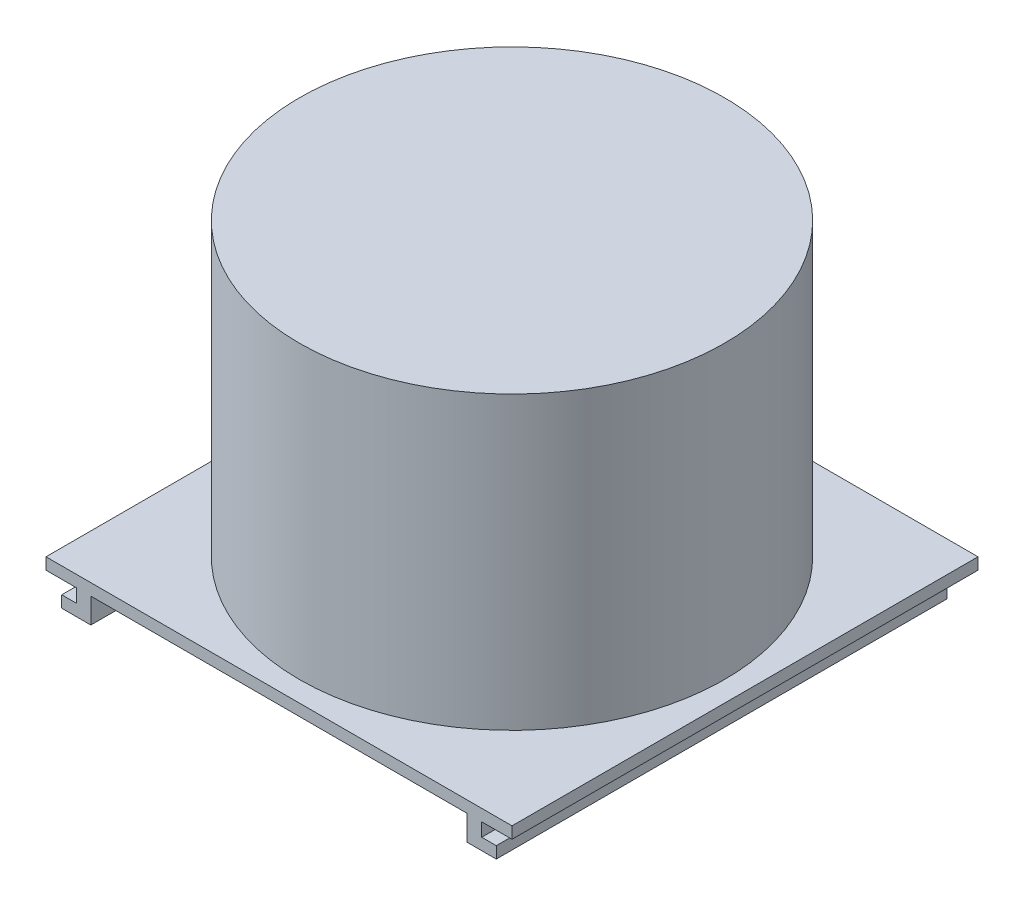
ISO-10303-21;
HEADER;
FILE_DESCRIPTION(('STEP AP214'),'2;1');
FILE_NAME('part.step','',(''),(''),'','','');
FILE_SCHEMA(('AUTOMOTIVE_DESIGN { 1 0 10303 214 1 1 1 1 }'));
ENDSEC;
DATA;
#1=APPLICATION_CONTEXT('core data for automotive mechanical design processes');
#2=APPLICATION_PROTOCOL_DEFINITION('international standard','automotive_design',2000,#1);
#3=PRODUCT_CONTEXT('',#1,'mechanical');
#4=PRODUCT('Part','Part','',(#3));
#5=PRODUCT_RELATED_PRODUCT_CATEGORY('part','',(#4));
#6=PRODUCT_DEFINITION_FORMATION('','',#4);
#7=PRODUCT_DEFINITION_CONTEXT('part definition',#1,'design');
#8=PRODUCT_DEFINITION('design','',#6,#7);
#9=PRODUCT_DEFINITION_SHAPE('','',#8);
#10=(LENGTH_UNIT() NAMED_UNIT(*) SI_UNIT(.MILLI.,.METRE.));
#11=(NAMED_UNIT(*) PLANE_ANGLE_UNIT() SI_UNIT($,.RADIAN.));
#12=(NAMED_UNIT(*) SI_UNIT($,.STERADIAN.) SOLID_ANGLE_UNIT());
#13=UNCERTAINTY_MEASURE_WITH_UNIT(LENGTH_MEASURE(1.E-05),#10,'distance_accuracy_value','');
#14=(GEOMETRIC_REPRESENTATION_CONTEXT(3) GLOBAL_UNCERTAINTY_ASSIGNED_CONTEXT((#13)) GLOBAL_UNIT_ASSIGNED_CONTEXT((#10,
#11,#12)) REPRESENTATION_CONTEXT('',''));
#15=CARTESIAN_POINT('',(0.,0.,0.));
#16=DIRECTION('',(0.,0.,1.));
#17=DIRECTION('',(1.,0.,0.));
#18=AXIS2_PLACEMENT_3D('',#15,#16,#17);
#19=CARTESIAN_POINT('',(0.,-2.,0.));
#20=DIRECTION('',(0.,1.,0.));
#21=DIRECTION('',(0.,0.,1.));
#22=AXIS2_PLACEMENT_3D('',#19,#20,#21);
#23=CYLINDRICAL_SURFACE('',#22,35.);
#24=CARTESIAN_POINT('',(0.,-2.,0.));
#25=DIRECTION('',(0.,1.,0.));
#26=DIRECTION('',(0.,0.,1.));
#27=AXIS2_PLACEMENT_3D('',#24,#25,#26);
#28=CIRCLE('',#27,35.);
#29=CARTESIAN_POINT('',(-32.3,-2.,-13.4799851631966));
#30=VERTEX_POINT('',#29);
#31=CARTESIAN_POINT('',(-34.8,-2.,-3.73630833845392));
#32=VERTEX_POINT('',#31);
#33=EDGE_CURVE('E297',#30,#32,#28,.T.);
#34=ORIENTED_EDGE('',*,*,#33,.F.);
#35=CARTESIAN_POINT('',(32.3,-1.99999999999999,-13.4799851631966));
#36=VERTEX_POINT('',#35);
#37=EDGE_CURVE('E296',#36,#30,#28,.T.);
#38=ORIENTED_EDGE('',*,*,#37,.F.);
#39=CARTESIAN_POINT('',(34.8,-2.,-3.73630833845404));
#40=VERTEX_POINT('',#39);
#41=EDGE_CURVE('E383',#40,#36,#28,.T.);
#42=ORIENTED_EDGE('',*,*,#41,.F.);
#43=CARTESIAN_POINT('',(34.8,-1.99999999999999,3.73630833845405));
#44=VERTEX_POINT('',#43);
#45=EDGE_CURVE('E394',#44,#40,#28,.T.);
#46=ORIENTED_EDGE('',*,*,#45,.F.);
#47=CARTESIAN_POINT('',(32.3,-2.,13.4799851631966));
#48=VERTEX_POINT('',#47);
#49=EDGE_CURVE('E408',#48,#44,#28,.T.);
#50=ORIENTED_EDGE('',*,*,#49,.F.);
#51=CARTESIAN_POINT('',(-32.3,-2.,13.4799851631966));
#52=VERTEX_POINT('',#51);
#53=EDGE_CURVE('E378',#52,#48,#28,.T.);
#54=ORIENTED_EDGE('',*,*,#53,.F.);
#55=CARTESIAN_POINT('',(-34.8,-2.,3.73630833845394));
#56=VERTEX_POINT('',#55);
#57=EDGE_CURVE('E373',#56,#52,#28,.T.);
#58=ORIENTED_EDGE('',*,*,#57,.F.);
#59=EDGE_CURVE('E301',#32,#56,#28,.T.);
#60=ORIENTED_EDGE('',*,*,#59,.F.);
#61=EDGE_LOOP('',(#34,#38,#42,#46,#50,#54,#58,#60));
#62=FACE_BOUND('',#61,.T.);
#63=CARTESIAN_POINT('',(0.,48.5,0.));
#64=DIRECTION('',(0.,1.,0.));
#65=DIRECTION('',(0.,0.,1.));
#66=AXIS2_PLACEMENT_3D('',#63,#64,#65);
#67=CIRCLE('',#66,35.);
#68=CARTESIAN_POINT('',(0.,48.5,35.));
#69=VERTEX_POINT('',#68);
#70=EDGE_CURVE('E12',#69,#69,#67,.F.);
#71=ORIENTED_EDGE('',*,*,#70,.F.);
#72=EDGE_LOOP('',(#71));
#73=FACE_BOUND('',#72,.T.);
#74=ADVANCED_FACE('F38',(#62,#73),#23,.F.);
#75=CARTESIAN_POINT('',(0.,-2.,0.));
#76=DIRECTION('',(0.,1.,0.));
#77=DIRECTION('',(0.,0.,1.));
#78=AXIS2_PLACEMENT_3D('',#75,#76,#77);
#79=PLANE('',#78);
#80=ORIENTED_EDGE('',*,*,#53,.T.);
#81=DIRECTION('',(0.,0.,1.));
#82=VECTOR('',#81,1.);
#83=CARTESIAN_POINT('',(32.3,-1.99999999999999,-46.594694837519));
#84=LINE('',#83,#82);
#85=CARTESIAN_POINT('',(32.3,-2.,40.));
#86=VERTEX_POINT('',#85);
#87=EDGE_CURVE('E192',#48,#86,#84,.T.);
#88=ORIENTED_EDGE('',*,*,#87,.T.);
#89=DIRECTION('',(1.,0.,0.));
#90=VECTOR('',#89,1.);
#91=CARTESIAN_POINT('',(0.,-2.,40.));
#92=LINE('',#91,#90);
#93=CARTESIAN_POINT('',(-32.3,-2.,40.));
#94=VERTEX_POINT('',#93);
#95=EDGE_CURVE('E288',#94,#86,#92,.T.);
#96=ORIENTED_EDGE('',*,*,#95,.F.);
#97=DIRECTION('',(0.,0.,1.));
#98=VECTOR('',#97,1.);
#99=CARTESIAN_POINT('',(-32.3,-2.,-46.594694837519));
#100=LINE('',#99,#98);
#101=EDGE_CURVE('E46',#52,#94,#100,.T.);
#102=ORIENTED_EDGE('',*,*,#101,.F.);
#103=EDGE_LOOP('',(#80,#88,#96,#102));
#104=FACE_BOUND('',#103,.T.);
#105=ADVANCED_FACE('F398',(#104),#79,.F.);
#106=CARTESIAN_POINT('',(34.8,-2.,40.));
#107=VERTEX_POINT('',#106);
#108=CARTESIAN_POINT('',(40.,-2.,40.));
#109=VERTEX_POINT('',#108);
#110=EDGE_CURVE('E289',#107,#109,#92,.T.);
#111=ORIENTED_EDGE('',*,*,#110,.F.);
#112=DIRECTION('',(0.,0.,1.));
#113=VECTOR('',#112,1.);
#114=CARTESIAN_POINT('',(34.8,-1.99999999999999,-46.594694837519));
#115=LINE('',#114,#113);
#116=EDGE_CURVE('E207',#44,#107,#115,.T.);
#117=ORIENTED_EDGE('',*,*,#116,.F.);
#118=ORIENTED_EDGE('',*,*,#45,.T.);
#119=CARTESIAN_POINT('',(34.8,-2.,-37.35));
#120=VERTEX_POINT('',#119);
#121=EDGE_CURVE('E53',#120,#40,#115,.T.);
#122=ORIENTED_EDGE('',*,*,#121,.F.);
#123=DIRECTION('',(1.,0.,0.));
#124=VECTOR('',#123,1.);
#125=CARTESIAN_POINT('',(34.8,-1.99999999999999,-37.35));
#126=LINE('',#125,#124);
#127=CARTESIAN_POINT('',(32.3,-2.,-37.35));
#128=VERTEX_POINT('',#127);
#129=EDGE_CURVE('E57',#128,#120,#126,.T.);
#130=ORIENTED_EDGE('',*,*,#129,.F.);
#131=EDGE_CURVE('E208',#128,#36,#84,.T.);
#132=ORIENTED_EDGE('',*,*,#131,.T.);
#133=ORIENTED_EDGE('',*,*,#37,.T.);
#134=CARTESIAN_POINT('',(-32.3,-2.,-37.35));
#135=VERTEX_POINT('',#134);
#136=EDGE_CURVE('E265',#135,#30,#100,.T.);
#137=ORIENTED_EDGE('',*,*,#136,.F.);
#138=DIRECTION('',(-1.,0.,0.));
#139=VECTOR('',#138,1.);
#140=CARTESIAN_POINT('',(0.,-2.,-37.35));
#141=LINE('',#140,#139);
#142=CARTESIAN_POINT('',(-34.8,-2.,-37.35));
#143=VERTEX_POINT('',#142);
#144=EDGE_CURVE('E239',#135,#143,#141,.T.);
#145=ORIENTED_EDGE('',*,*,#144,.T.);
#146=DIRECTION('',(0.,0.,1.));
#147=VECTOR('',#146,1.);
#148=CARTESIAN_POINT('',(-34.8,-2.,-46.594694837519));
#149=LINE('',#148,#147);
#150=EDGE_CURVE('E260',#143,#32,#149,.T.);
#151=ORIENTED_EDGE('',*,*,#150,.T.);
#152=ORIENTED_EDGE('',*,*,#59,.T.);
#153=CARTESIAN_POINT('',(-34.8,-2.,40.));
#154=VERTEX_POINT('',#153);
#155=EDGE_CURVE('E264',#56,#154,#149,.T.);
#156=ORIENTED_EDGE('',*,*,#155,.T.);
#157=CARTESIAN_POINT('',(-40.,-2.,40.));
#158=VERTEX_POINT('',#157);
#159=EDGE_CURVE('E284',#158,#154,#92,.T.);
#160=ORIENTED_EDGE('',*,*,#159,.F.);
#161=DIRECTION('',(0.,0.,-1.));
#162=VECTOR('',#161,1.);
#163=CARTESIAN_POINT('',(-40.,-2.,0.));
#164=LINE('',#163,#162);
#165=CARTESIAN_POINT('',(-40.,-2.,-40.));
#166=VERTEX_POINT('',#165);
#167=EDGE_CURVE('E294',#158,#166,#164,.T.);
#168=ORIENTED_EDGE('',*,*,#167,.T.);
#169=DIRECTION('',(1.,0.,0.));
#170=VECTOR('',#169,1.);
#171=CARTESIAN_POINT('',(0.,-2.,-40.));
#172=LINE('',#171,#170);
#173=CARTESIAN_POINT('',(40.,-2.,-40.));
#174=VERTEX_POINT('',#173);
#175=EDGE_CURVE('E292',#166,#174,#172,.T.);
#176=ORIENTED_EDGE('',*,*,#175,.T.);
#177=DIRECTION('',(0.,0.,-1.));
#178=VECTOR('',#177,1.);
#179=CARTESIAN_POINT('',(40.,-2.,0.));
#180=LINE('',#179,#178);
#181=EDGE_CURVE('E287',#109,#174,#180,.T.);
#182=ORIENTED_EDGE('',*,*,#181,.F.);
#183=EDGE_LOOP('',(#111,#117,#118,#122,#130,#132,#133,#137,#145,#151,#152,#156,#160,#168,#176,#182));
#184=FACE_BOUND('',#183,.T.);
#185=ADVANCED_FACE('F337',(#184),#79,.F.);
#186=CARTESIAN_POINT('',(0.,-2.,40.));
#187=DIRECTION('',(0.,0.,1.));
#188=DIRECTION('',(1.,0.,0.));
#189=AXIS2_PLACEMENT_3D('',#186,#187,#188);
#190=PLANE('',#189);
#191=DIRECTION('',(1.,0.,0.));
#192=VECTOR('',#191,1.);
#193=CARTESIAN_POINT('',(0.,0.,40.));
#194=LINE('',#193,#192);
#195=CARTESIAN_POINT('',(-40.,0.,40.));
#196=VERTEX_POINT('',#195);
#197=CARTESIAN_POINT('',(40.,0.,40.));
#198=VERTEX_POINT('',#197);
#199=EDGE_CURVE('E281',#196,#198,#194,.T.);
#200=ORIENTED_EDGE('',*,*,#199,.F.);
#201=DIRECTION('',(0.,1.,0.));
#202=VECTOR('',#201,1.);
#203=CARTESIAN_POINT('',(-40.,-2.,40.));
#204=LINE('',#203,#202);
#205=EDGE_CURVE('E312',#158,#196,#204,.T.);
#206=ORIENTED_EDGE('',*,*,#205,.F.);
#207=ORIENTED_EDGE('',*,*,#159,.T.);
#208=DIRECTION('',(0.,1.,0.));
#209=VECTOR('',#208,1.);
#210=CARTESIAN_POINT('',(-34.8,0.,40.));
#211=LINE('',#210,#209);
#212=CARTESIAN_POINT('',(-34.8,-4.3,40.));
#213=VERTEX_POINT('',#212);
#214=EDGE_CURVE('E223',#213,#154,#211,.T.);
#215=ORIENTED_EDGE('',*,*,#214,.F.);
#216=DIRECTION('',(1.,0.,0.));
#217=VECTOR('',#216,1.);
#218=CARTESIAN_POINT('',(0.,-4.3,40.));
#219=LINE('',#218,#217);
#220=CARTESIAN_POINT('',(-37.3,-4.3,40.));
#221=VERTEX_POINT('',#220);
#222=EDGE_CURVE('E247',#221,#213,#219,.T.);
#223=ORIENTED_EDGE('',*,*,#222,.F.);
#224=DIRECTION('',(0.,1.,0.));
#225=VECTOR('',#224,1.);
#226=CARTESIAN_POINT('',(-37.3,0.,40.));
#227=LINE('',#226,#225);
#228=CARTESIAN_POINT('',(-37.3,-6.3,40.));
#229=VERTEX_POINT('',#228);
#230=EDGE_CURVE('E250',#229,#221,#227,.T.);
#231=ORIENTED_EDGE('',*,*,#230,.F.);
#232=DIRECTION('',(-1.,0.,0.));
#233=VECTOR('',#232,1.);
#234=CARTESIAN_POINT('',(0.,-6.29999999999999,40.));
#235=LINE('',#234,#233);
#236=CARTESIAN_POINT('',(-32.3,-6.3,40.));
#237=VERTEX_POINT('',#236);
#238=EDGE_CURVE('E253',#237,#229,#235,.T.);
#239=ORIENTED_EDGE('',*,*,#238,.F.);
#240=DIRECTION('',(0.,-1.,0.));
#241=VECTOR('',#240,1.);
#242=CARTESIAN_POINT('',(-32.3,0.,40.));
#243=LINE('',#242,#241);
#244=EDGE_CURVE('E256',#94,#237,#243,.T.);
#245=ORIENTED_EDGE('',*,*,#244,.F.);
#246=ORIENTED_EDGE('',*,*,#95,.T.);
#247=DIRECTION('',(0.,-1.,0.));
#248=VECTOR('',#247,1.);
#249=CARTESIAN_POINT('',(32.3,-1.99999999999999,40.));
#250=LINE('',#249,#248);
#251=CARTESIAN_POINT('',(32.3,-6.29999999999999,40.));
#252=VERTEX_POINT('',#251);
#253=EDGE_CURVE('E220',#86,#252,#250,.T.);
#254=ORIENTED_EDGE('',*,*,#253,.T.);
#255=DIRECTION('',(1.,0.,0.));
#256=VECTOR('',#255,1.);
#257=CARTESIAN_POINT('',(32.3,-6.29999999999999,40.));
#258=LINE('',#257,#256);
#259=CARTESIAN_POINT('',(37.3,-6.3,40.));
#260=VERTEX_POINT('',#259);
#261=EDGE_CURVE('E217',#252,#260,#258,.T.);
#262=ORIENTED_EDGE('',*,*,#261,.T.);
#263=DIRECTION('',(0.,1.,0.));
#264=VECTOR('',#263,1.);
#265=CARTESIAN_POINT('',(37.3,-6.3,40.));
#266=LINE('',#265,#264);
#267=CARTESIAN_POINT('',(37.3,-4.3,40.));
#268=VERTEX_POINT('',#267);
#269=EDGE_CURVE('E215',#260,#268,#266,.T.);
#270=ORIENTED_EDGE('',*,*,#269,.T.);
#271=DIRECTION('',(-1.,0.,0.));
#272=VECTOR('',#271,1.);
#273=CARTESIAN_POINT('',(37.3,-4.3,40.));
#274=LINE('',#273,#272);
#275=CARTESIAN_POINT('',(34.8,-4.29999999999999,40.));
#276=VERTEX_POINT('',#275);
#277=EDGE_CURVE('E196',#268,#276,#274,.T.);
#278=ORIENTED_EDGE('',*,*,#277,.T.);
#279=DIRECTION('',(0.,1.,0.));
#280=VECTOR('',#279,1.);
#281=CARTESIAN_POINT('',(34.8,-4.29999999999999,40.));
#282=LINE('',#281,#280);
#283=EDGE_CURVE('E211',#276,#107,#282,.T.);
#284=ORIENTED_EDGE('',*,*,#283,.T.);
#285=ORIENTED_EDGE('',*,*,#110,.T.);
#286=DIRECTION('',(0.,1.,0.));
#287=VECTOR('',#286,1.);
#288=CARTESIAN_POINT('',(40.,-2.,40.));
#289=LINE('',#288,#287);
#290=EDGE_CURVE('E300',#109,#198,#289,.T.);
#291=ORIENTED_EDGE('',*,*,#290,.T.);
#292=EDGE_LOOP('',(#200,#206,#207,#215,#223,#231,#239,#245,#246,#254,#262,#270,#278,#284,#285,#291));
#293=FACE_BOUND('',#292,.T.);
#294=ADVANCED_FACE('F40',(#293),#190,.T.);
#295=CARTESIAN_POINT('',(-40.,-2.,0.));
#296=DIRECTION('',(1.,0.,0.));
#297=DIRECTION('',(0.,0.,-1.));
#298=AXIS2_PLACEMENT_3D('',#295,#296,#297);
#299=PLANE('',#298);
#300=DIRECTION('',(0.,0.,-1.));
#301=VECTOR('',#300,1.);
#302=CARTESIAN_POINT('',(-40.,0.,0.));
#303=LINE('',#302,#301);
#304=CARTESIAN_POINT('',(-40.,0.,-40.));
#305=VERTEX_POINT('',#304);
#306=EDGE_CURVE('E310',#196,#305,#303,.T.);
#307=ORIENTED_EDGE('',*,*,#306,.T.);
#308=DIRECTION('',(0.,1.,0.));
#309=VECTOR('',#308,1.);
#310=CARTESIAN_POINT('',(-40.,-2.,-40.));
#311=LINE('',#310,#309);
#312=EDGE_CURVE('E314',#166,#305,#311,.T.);
#313=ORIENTED_EDGE('',*,*,#312,.F.);
#314=ORIENTED_EDGE('',*,*,#167,.F.);
#315=ORIENTED_EDGE('',*,*,#205,.T.);
#316=EDGE_LOOP('',(#307,#313,#314,#315));
#317=FACE_BOUND('',#316,.T.);
#318=ADVANCED_FACE('F332',(#317),#299,.F.);
#319=CARTESIAN_POINT('',(0.,-2.,-40.));
#320=DIRECTION('',(0.,0.,1.));
#321=DIRECTION('',(1.,0.,0.));
#322=AXIS2_PLACEMENT_3D('',#319,#320,#321);
#323=PLANE('',#322);
#324=DIRECTION('',(1.,0.,0.));
#325=VECTOR('',#324,1.);
#326=CARTESIAN_POINT('',(0.,0.,-40.));
#327=LINE('',#326,#325);
#328=CARTESIAN_POINT('',(40.,0.,-40.));
#329=VERTEX_POINT('',#328);
#330=EDGE_CURVE('E307',#305,#329,#327,.T.);
#331=ORIENTED_EDGE('',*,*,#330,.T.);
#332=DIRECTION('',(0.,1.,0.));
#333=VECTOR('',#332,1.);
#334=CARTESIAN_POINT('',(40.,-2.,-40.));
#335=LINE('',#334,#333);
#336=EDGE_CURVE('E317',#174,#329,#335,.T.);
#337=ORIENTED_EDGE('',*,*,#336,.F.);
#338=ORIENTED_EDGE('',*,*,#175,.F.);
#339=ORIENTED_EDGE('',*,*,#312,.T.);
#340=EDGE_LOOP('',(#331,#337,#338,#339));
#341=FACE_BOUND('',#340,.T.);
#342=ADVANCED_FACE('F336',(#341),#323,.F.);
#343=CARTESIAN_POINT('',(40.,-2.,0.));
#344=DIRECTION('',(1.,0.,0.));
#345=DIRECTION('',(0.,0.,-1.));
#346=AXIS2_PLACEMENT_3D('',#343,#344,#345);
#347=PLANE('',#346);
#348=DIRECTION('',(0.,0.,-1.));
#349=VECTOR('',#348,1.);
#350=CARTESIAN_POINT('',(40.,0.,0.));
#351=LINE('',#350,#349);
#352=EDGE_CURVE('E304',#198,#329,#351,.T.);
#353=ORIENTED_EDGE('',*,*,#352,.F.);
#354=ORIENTED_EDGE('',*,*,#290,.F.);
#355=ORIENTED_EDGE('',*,*,#181,.T.);
#356=ORIENTED_EDGE('',*,*,#336,.T.);
#357=EDGE_LOOP('',(#353,#354,#355,#356));
#358=FACE_BOUND('',#357,.T.);
#359=ADVANCED_FACE('F324',(#358),#347,.T.);
#360=CARTESIAN_POINT('',(0.,0.,0.));
#361=DIRECTION('',(0.,1.,0.));
#362=DIRECTION('',(0.,0.,1.));
#363=AXIS2_PLACEMENT_3D('',#360,#361,#362);
#364=PLANE('',#363);
#365=CARTESIAN_POINT('',(0.,0.,0.));
#366=DIRECTION('',(0.,1.,0.));
#367=DIRECTION('',(0.,0.,1.));
#368=AXIS2_PLACEMENT_3D('',#365,#366,#367);
#369=CIRCLE('',#368,36.5);
#370=CARTESIAN_POINT('',(0.,0.,36.5));
#371=VERTEX_POINT('',#370);
#372=EDGE_CURVE('E245',#371,#371,#369,.T.);
#373=ORIENTED_EDGE('',*,*,#372,.F.);
#374=EDGE_LOOP('',(#373));
#375=FACE_BOUND('',#374,.T.);
#376=ORIENTED_EDGE('',*,*,#199,.T.);
#377=ORIENTED_EDGE('',*,*,#352,.T.);
#378=ORIENTED_EDGE('',*,*,#330,.F.);
#379=ORIENTED_EDGE('',*,*,#306,.F.);
#380=EDGE_LOOP('',(#376,#377,#378,#379));
#381=FACE_BOUND('',#380,.T.);
#382=ADVANCED_FACE('F329',(#375,#381),#364,.T.);
#383=CARTESIAN_POINT('',(0.,50.,0.));
#384=DIRECTION('',(0.,-1.,0.));
#385=DIRECTION('',(0.,0.,-1.));
#386=AXIS2_PLACEMENT_3D('',#383,#384,#385);
#387=CYLINDRICAL_SURFACE('',#386,36.5);
#388=CARTESIAN_POINT('',(0.,50.,0.));
#389=DIRECTION('',(0.,1.,0.));
#390=DIRECTION('',(0.,0.,1.));
#391=AXIS2_PLACEMENT_3D('',#388,#389,#390);
#392=CIRCLE('',#391,36.5);
#393=CARTESIAN_POINT('',(0.,50.,36.5));
#394=VERTEX_POINT('',#393);
#395=EDGE_CURVE('E278',#394,#394,#392,.T.);
#396=ORIENTED_EDGE('',*,*,#395,.F.);
#397=EDGE_LOOP('',(#396));
#398=FACE_BOUND('',#397,.T.);
#399=ORIENTED_EDGE('',*,*,#372,.T.);
#400=EDGE_LOOP('',(#399));
#401=FACE_BOUND('',#400,.T.);
#402=ADVANCED_FACE('F433',(#398,#401),#387,.T.);
#403=CARTESIAN_POINT('',(0.,50.,0.));
#404=DIRECTION('',(0.,1.,0.));
#405=DIRECTION('',(0.,0.,1.));
#406=AXIS2_PLACEMENT_3D('',#403,#404,#405);
#407=PLANE('',#406);
#408=ORIENTED_EDGE('',*,*,#395,.T.);
#409=EDGE_LOOP('',(#408));
#410=FACE_BOUND('',#409,.T.);
#411=ADVANCED_FACE('F438',(#410),#407,.T.);
#412=CARTESIAN_POINT('',(0.,-2.,-46.594694837519));
#413=DIRECTION('',(0.,-1.,0.));
#414=DIRECTION('',(0.,0.,-1.));
#415=AXIS2_PLACEMENT_3D('',#412,#413,#414);
#416=PLANE('',#415);
#417=EDGE_CURVE('E268',#30,#52,#100,.T.);
#418=ORIENTED_EDGE('',*,*,#417,.F.);
#419=ORIENTED_EDGE('',*,*,#33,.T.);
#420=EDGE_CURVE('E263',#32,#56,#149,.T.);
#421=ORIENTED_EDGE('',*,*,#420,.T.);
#422=ORIENTED_EDGE('',*,*,#57,.T.);
#423=EDGE_LOOP('',(#418,#419,#421,#422));
#424=FACE_BOUND('',#423,.T.);
#425=ADVANCED_FACE('F372',(#424),#416,.F.);
#426=CARTESIAN_POINT('',(0.,-4.3,-46.594694837519));
#427=DIRECTION('',(0.,-1.,0.));
#428=DIRECTION('',(0.,0.,-1.));
#429=AXIS2_PLACEMENT_3D('',#426,#427,#428);
#430=PLANE('',#429);
#431=DIRECTION('',(0.,0.,1.));
#432=VECTOR('',#431,1.);
#433=CARTESIAN_POINT('',(-34.8,-4.3,-46.594694837519));
#434=LINE('',#433,#432);
#435=CARTESIAN_POINT('',(-34.8,-4.3,-37.35));
#436=VERTEX_POINT('',#435);
#437=EDGE_CURVE('E259',#436,#213,#434,.T.);
#438=ORIENTED_EDGE('',*,*,#437,.F.);
#439=DIRECTION('',(-1.,0.,0.));
#440=VECTOR('',#439,1.);
#441=CARTESIAN_POINT('',(0.,-4.3,-37.35));
#442=LINE('',#441,#440);
#443=CARTESIAN_POINT('',(-37.3,-4.3,-37.35));
#444=VERTEX_POINT('',#443);
#445=EDGE_CURVE('E233',#436,#444,#442,.T.);
#446=ORIENTED_EDGE('',*,*,#445,.T.);
#447=DIRECTION('',(0.,0.,1.));
#448=VECTOR('',#447,1.);
#449=CARTESIAN_POINT('',(-37.3,-4.3,-46.594694837519));
#450=LINE('',#449,#448);
#451=EDGE_CURVE('E273',#444,#221,#450,.T.);
#452=ORIENTED_EDGE('',*,*,#451,.T.);
#453=ORIENTED_EDGE('',*,*,#222,.T.);
#454=EDGE_LOOP('',(#438,#446,#452,#453));
#455=FACE_BOUND('',#454,.T.);
#456=ADVANCED_FACE('F350',(#455),#430,.F.);
#457=CARTESIAN_POINT('',(-37.3,0.,-46.594694837519));
#458=DIRECTION('',(1.,0.,0.));
#459=DIRECTION('',(0.,0.,-1.));
#460=AXIS2_PLACEMENT_3D('',#457,#458,#459);
#461=PLANE('',#460);
#462=ORIENTED_EDGE('',*,*,#451,.F.);
#463=DIRECTION('',(0.,-1.,0.));
#464=VECTOR('',#463,1.);
#465=CARTESIAN_POINT('',(-37.3,0.,-37.35));
#466=LINE('',#465,#464);
#467=CARTESIAN_POINT('',(-37.3,-6.3,-37.35));
#468=VERTEX_POINT('',#467);
#469=EDGE_CURVE('E229',#444,#468,#466,.T.);
#470=ORIENTED_EDGE('',*,*,#469,.T.);
#471=DIRECTION('',(0.,0.,1.));
#472=VECTOR('',#471,1.);
#473=CARTESIAN_POINT('',(-37.3,-6.3,-46.594694837519));
#474=LINE('',#473,#472);
#475=EDGE_CURVE('E271',#468,#229,#474,.T.);
#476=ORIENTED_EDGE('',*,*,#475,.T.);
#477=ORIENTED_EDGE('',*,*,#230,.T.);
#478=EDGE_LOOP('',(#462,#470,#476,#477));
#479=FACE_BOUND('',#478,.T.);
#480=ADVANCED_FACE('F353',(#479),#461,.F.);
#481=CARTESIAN_POINT('',(0.,-6.29999999999999,-46.594694837519));
#482=DIRECTION('',(0.,1.,0.));
#483=DIRECTION('',(-1.,0.,0.));
#484=AXIS2_PLACEMENT_3D('',#481,#482,#483);
#485=PLANE('',#484);
#486=ORIENTED_EDGE('',*,*,#475,.F.);
#487=DIRECTION('',(1.,0.,0.));
#488=VECTOR('',#487,1.);
#489=CARTESIAN_POINT('',(0.,-6.29999999999999,-37.35));
#490=LINE('',#489,#488);
#491=CARTESIAN_POINT('',(-32.3,-6.3,-37.35));
#492=VERTEX_POINT('',#491);
#493=EDGE_CURVE('E232',#468,#492,#490,.T.);
#494=ORIENTED_EDGE('',*,*,#493,.T.);
#495=DIRECTION('',(0.,0.,1.));
#496=VECTOR('',#495,1.);
#497=CARTESIAN_POINT('',(-32.3,-6.3,-46.594694837519));
#498=LINE('',#497,#496);
#499=EDGE_CURVE('E269',#492,#237,#498,.T.);
#500=ORIENTED_EDGE('',*,*,#499,.T.);
#501=ORIENTED_EDGE('',*,*,#238,.T.);
#502=EDGE_LOOP('',(#486,#494,#500,#501));
#503=FACE_BOUND('',#502,.T.);
#504=ADVANCED_FACE('F360',(#503),#485,.F.);
#505=CARTESIAN_POINT('',(-32.3,0.,-46.594694837519));
#506=DIRECTION('',(-1.,0.,0.));
#507=DIRECTION('',(0.,0.,1.));
#508=AXIS2_PLACEMENT_3D('',#505,#506,#507);
#509=PLANE('',#508);
#510=ORIENTED_EDGE('',*,*,#499,.F.);
#511=DIRECTION('',(0.,1.,0.));
#512=VECTOR('',#511,1.);
#513=CARTESIAN_POINT('',(-32.3,0.,-37.35));
#514=LINE('',#513,#512);
#515=EDGE_CURVE('E236',#492,#135,#514,.T.);
#516=ORIENTED_EDGE('',*,*,#515,.T.);
#517=ORIENTED_EDGE('',*,*,#136,.T.);
#518=ORIENTED_EDGE('',*,*,#417,.T.);
#519=ORIENTED_EDGE('',*,*,#101,.T.);
#520=ORIENTED_EDGE('',*,*,#244,.T.);
#521=EDGE_LOOP('',(#510,#516,#517,#518,#519,#520));
#522=FACE_BOUND('',#521,.T.);
#523=ADVANCED_FACE('F363',(#522),#509,.F.);
#524=CARTESIAN_POINT('',(-34.8,0.,-46.594694837519));
#525=DIRECTION('',(1.,0.,0.));
#526=DIRECTION('',(0.,0.,-1.));
#527=AXIS2_PLACEMENT_3D('',#524,#525,#526);
#528=PLANE('',#527);
#529=ORIENTED_EDGE('',*,*,#150,.F.);
#530=DIRECTION('',(0.,-1.,0.));
#531=VECTOR('',#530,1.);
#532=CARTESIAN_POINT('',(-34.8,0.,-37.35));
#533=LINE('',#532,#531);
#534=EDGE_CURVE('E242',#143,#436,#533,.T.);
#535=ORIENTED_EDGE('',*,*,#534,.T.);
#536=ORIENTED_EDGE('',*,*,#437,.T.);
#537=ORIENTED_EDGE('',*,*,#214,.T.);
#538=ORIENTED_EDGE('',*,*,#155,.F.);
#539=ORIENTED_EDGE('',*,*,#420,.F.);
#540=EDGE_LOOP('',(#529,#535,#536,#537,#538,#539));
#541=FACE_BOUND('',#540,.T.);
#542=ADVANCED_FACE('F346',(#541),#528,.F.);
#543=CARTESIAN_POINT('',(0.,-2.,-37.35));
#544=DIRECTION('',(0.,0.,1.));
#545=DIRECTION('',(1.,0.,0.));
#546=AXIS2_PLACEMENT_3D('',#543,#544,#545);
#547=PLANE('',#546);
#548=ORIENTED_EDGE('',*,*,#144,.F.);
#549=ORIENTED_EDGE('',*,*,#515,.F.);
#550=ORIENTED_EDGE('',*,*,#493,.F.);
#551=ORIENTED_EDGE('',*,*,#469,.F.);
#552=ORIENTED_EDGE('',*,*,#445,.F.);
#553=ORIENTED_EDGE('',*,*,#534,.F.);
#554=EDGE_LOOP('',(#548,#549,#550,#551,#552,#553));
#555=FACE_BOUND('',#554,.T.);
#556=ADVANCED_FACE('F381',(#555),#547,.F.);
#557=CARTESIAN_POINT('',(34.8,-1.99999999999999,-46.594694837519));
#558=DIRECTION('',(0.,1.,0.));
#559=DIRECTION('',(-1.,0.,0.));
#560=AXIS2_PLACEMENT_3D('',#557,#558,#559);
#561=PLANE('',#560);
#562=ORIENTED_EDGE('',*,*,#41,.T.);
#563=EDGE_CURVE('E210',#36,#48,#84,.T.);
#564=ORIENTED_EDGE('',*,*,#563,.T.);
#565=ORIENTED_EDGE('',*,*,#49,.T.);
#566=EDGE_CURVE('E206',#40,#44,#115,.T.);
#567=ORIENTED_EDGE('',*,*,#566,.F.);
#568=EDGE_LOOP('',(#562,#564,#565,#567));
#569=FACE_BOUND('',#568,.T.);
#570=ADVANCED_FACE('F391',(#569),#561,.T.);
#571=CARTESIAN_POINT('',(32.3,-1.99999999999999,-46.594694837519));
#572=DIRECTION('',(-1.,0.,0.));
#573=DIRECTION('',(0.,0.,1.));
#574=AXIS2_PLACEMENT_3D('',#571,#572,#573);
#575=PLANE('',#574);
#576=DIRECTION('',(0.,1.,0.));
#577=VECTOR('',#576,1.);
#578=CARTESIAN_POINT('',(32.3,-1.99999999999999,-37.35));
#579=LINE('',#578,#577);
#580=CARTESIAN_POINT('',(32.3,-6.29999999999999,-37.35));
#581=VERTEX_POINT('',#580);
#582=EDGE_CURVE('E224',#581,#128,#579,.T.);
#583=ORIENTED_EDGE('',*,*,#582,.F.);
#584=DIRECTION('',(0.,0.,1.));
#585=VECTOR('',#584,1.);
#586=CARTESIAN_POINT('',(32.3,-6.29999999999999,-46.594694837519));
#587=LINE('',#586,#585);
#588=EDGE_CURVE('E200',#581,#252,#587,.T.);
#589=ORIENTED_EDGE('',*,*,#588,.T.);
#590=ORIENTED_EDGE('',*,*,#253,.F.);
#591=ORIENTED_EDGE('',*,*,#87,.F.);
#592=ORIENTED_EDGE('',*,*,#563,.F.);
#593=ORIENTED_EDGE('',*,*,#131,.F.);
#594=EDGE_LOOP('',(#583,#589,#590,#591,#592,#593));
#595=FACE_BOUND('',#594,.T.);
#596=ADVANCED_FACE('F396',(#595),#575,.T.);
#597=CARTESIAN_POINT('',(34.8,-4.29999999999999,-46.594694837519));
#598=DIRECTION('',(1.,0.,0.));
#599=DIRECTION('',(0.,0.,-1.));
#600=AXIS2_PLACEMENT_3D('',#597,#598,#599);
#601=PLANE('',#600);
#602=DIRECTION('',(0.,-1.,0.));
#603=VECTOR('',#602,1.);
#604=CARTESIAN_POINT('',(34.8,-4.29999999999999,-37.35));
#605=LINE('',#604,#603);
#606=CARTESIAN_POINT('',(34.8,-4.29999999999999,-37.35));
#607=VERTEX_POINT('',#606);
#608=EDGE_CURVE('E180',#120,#607,#605,.T.);
#609=ORIENTED_EDGE('',*,*,#608,.F.);
#610=ORIENTED_EDGE('',*,*,#121,.T.);
#611=ORIENTED_EDGE('',*,*,#566,.T.);
#612=ORIENTED_EDGE('',*,*,#116,.T.);
#613=ORIENTED_EDGE('',*,*,#283,.F.);
#614=DIRECTION('',(0.,0.,1.));
#615=VECTOR('',#614,1.);
#616=CARTESIAN_POINT('',(34.8,-4.29999999999999,-46.594694837519));
#617=LINE('',#616,#615);
#618=EDGE_CURVE('E198',#607,#276,#617,.T.);
#619=ORIENTED_EDGE('',*,*,#618,.F.);
#620=EDGE_LOOP('',(#609,#610,#611,#612,#613,#619));
#621=FACE_BOUND('',#620,.T.);
#622=ADVANCED_FACE('F406',(#621),#601,.T.);
#623=CARTESIAN_POINT('',(37.3,-4.3,-46.594694837519));
#624=DIRECTION('',(0.,1.,0.));
#625=DIRECTION('',(-1.,0.,0.));
#626=AXIS2_PLACEMENT_3D('',#623,#624,#625);
#627=PLANE('',#626);
#628=DIRECTION('',(1.,0.,0.));
#629=VECTOR('',#628,1.);
#630=CARTESIAN_POINT('',(37.3,-4.3,-37.35));
#631=LINE('',#630,#629);
#632=CARTESIAN_POINT('',(37.3,-4.3,-37.35));
#633=VERTEX_POINT('',#632);
#634=EDGE_CURVE('E174',#607,#633,#631,.T.);
#635=ORIENTED_EDGE('',*,*,#634,.F.);
#636=ORIENTED_EDGE('',*,*,#618,.T.);
#637=ORIENTED_EDGE('',*,*,#277,.F.);
#638=DIRECTION('',(0.,0.,1.));
#639=VECTOR('',#638,1.);
#640=CARTESIAN_POINT('',(37.3,-4.3,-46.594694837519));
#641=LINE('',#640,#639);
#642=EDGE_CURVE('E188',#633,#268,#641,.T.);
#643=ORIENTED_EDGE('',*,*,#642,.F.);
#644=EDGE_LOOP('',(#635,#636,#637,#643));
#645=FACE_BOUND('',#644,.T.);
#646=ADVANCED_FACE('F194',(#645),#627,.T.);
#647=CARTESIAN_POINT('',(37.3,-6.3,-46.594694837519));
#648=DIRECTION('',(1.,0.,0.));
#649=DIRECTION('',(0.,0.,-1.));
#650=AXIS2_PLACEMENT_3D('',#647,#648,#649);
#651=PLANE('',#650);
#652=DIRECTION('',(0.,-1.,0.));
#653=VECTOR('',#652,1.);
#654=CARTESIAN_POINT('',(37.3,-6.3,-37.35));
#655=LINE('',#654,#653);
#656=CARTESIAN_POINT('',(37.3,-6.3,-37.35));
#657=VERTEX_POINT('',#656);
#658=EDGE_CURVE('E177',#633,#657,#655,.T.);
#659=ORIENTED_EDGE('',*,*,#658,.F.);
#660=ORIENTED_EDGE('',*,*,#642,.T.);
#661=ORIENTED_EDGE('',*,*,#269,.F.);
#662=DIRECTION('',(0.,0.,1.));
#663=VECTOR('',#662,1.);
#664=CARTESIAN_POINT('',(37.3,-6.3,-46.594694837519));
#665=LINE('',#664,#663);
#666=EDGE_CURVE('E190',#657,#260,#665,.T.);
#667=ORIENTED_EDGE('',*,*,#666,.F.);
#668=EDGE_LOOP('',(#659,#660,#661,#667));
#669=FACE_BOUND('',#668,.T.);
#670=ADVANCED_FACE('F186',(#669),#651,.T.);
#671=CARTESIAN_POINT('',(32.3,-6.29999999999999,-46.594694837519));
#672=DIRECTION('',(0.,-1.,0.));
#673=DIRECTION('',(1.,0.,0.));
#674=AXIS2_PLACEMENT_3D('',#671,#672,#673);
#675=PLANE('',#674);
#676=DIRECTION('',(-1.,0.,0.));
#677=VECTOR('',#676,1.);
#678=CARTESIAN_POINT('',(32.3,-6.29999999999999,-37.35));
#679=LINE('',#678,#677);
#680=EDGE_CURVE('E226',#657,#581,#679,.T.);
#681=ORIENTED_EDGE('',*,*,#680,.F.);
#682=ORIENTED_EDGE('',*,*,#666,.T.);
#683=ORIENTED_EDGE('',*,*,#261,.F.);
#684=ORIENTED_EDGE('',*,*,#588,.F.);
#685=EDGE_LOOP('',(#681,#682,#683,#684));
#686=FACE_BOUND('',#685,.T.);
#687=ADVANCED_FACE('F402',(#686),#675,.T.);
#688=CARTESIAN_POINT('',(0.,-2.,-37.35));
#689=DIRECTION('',(0.,0.,1.));
#690=DIRECTION('',(1.,0.,0.));
#691=AXIS2_PLACEMENT_3D('',#688,#689,#690);
#692=PLANE('',#691);
#693=ORIENTED_EDGE('',*,*,#582,.T.);
#694=ORIENTED_EDGE('',*,*,#129,.T.);
#695=ORIENTED_EDGE('',*,*,#608,.T.);
#696=ORIENTED_EDGE('',*,*,#634,.T.);
#697=ORIENTED_EDGE('',*,*,#658,.T.);
#698=ORIENTED_EDGE('',*,*,#680,.T.);
#699=EDGE_LOOP('',(#693,#694,#695,#696,#697,#698));
#700=FACE_BOUND('',#699,.T.);
#701=ADVANCED_FACE('F176',(#700),#692,.F.);
#702=CARTESIAN_POINT('',(0.,48.5,0.));
#703=DIRECTION('',(0.,1.,0.));
#704=DIRECTION('',(0.,0.,1.));
#705=AXIS2_PLACEMENT_3D('',#702,#703,#704);
#706=PLANE('',#705);
#707=ORIENTED_EDGE('',*,*,#70,.T.);
#708=EDGE_LOOP('',(#707));
#709=FACE_BOUND('',#708,.T.);
#710=ADVANCED_FACE('F513',(#709),#706,.F.);
#711=CLOSED_SHELL('',(#74,#105,#185,#294,#318,#342,#359,#382,#402,#411,#425,#456,#480,#504,#523,
#542,#556,#570,#596,#622,#646,#670,#687,#701,#710));
#712=MANIFOLD_SOLID_BREP('B2',#711);
#713=ADVANCED_BREP_SHAPE_REPRESENTATION('',(#18,#712),#14);
#714=SHAPE_DEFINITION_REPRESENTATION(#9,#713);
ENDSEC;
END-ISO-10303-21;
